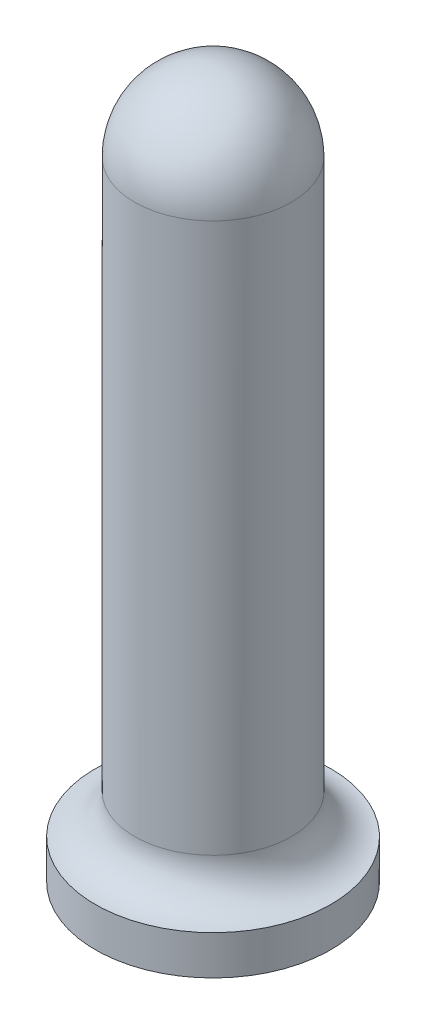
ISO-10303-21;
HEADER;
FILE_DESCRIPTION(('STEP AP214'),'2;1');
FILE_NAME('part.step','',(''),(''),'','','');
FILE_SCHEMA(('AUTOMOTIVE_DESIGN { 1 0 10303 214 1 1 1 1 }'));
ENDSEC;
DATA;
#1=APPLICATION_CONTEXT('core data for automotive mechanical design processes');
#2=APPLICATION_PROTOCOL_DEFINITION('international standard','automotive_design',2000,#1);
#3=PRODUCT_CONTEXT('',#1,'mechanical');
#4=PRODUCT('Part','Part','',(#3));
#5=PRODUCT_RELATED_PRODUCT_CATEGORY('part','',(#4));
#6=PRODUCT_DEFINITION_FORMATION('','',#4);
#7=PRODUCT_DEFINITION_CONTEXT('part definition',#1,'design');
#8=PRODUCT_DEFINITION('design','',#6,#7);
#9=PRODUCT_DEFINITION_SHAPE('','',#8);
#10=(LENGTH_UNIT() NAMED_UNIT(*) SI_UNIT(.MILLI.,.METRE.));
#11=(NAMED_UNIT(*) PLANE_ANGLE_UNIT() SI_UNIT($,.RADIAN.));
#12=(NAMED_UNIT(*) SI_UNIT($,.STERADIAN.) SOLID_ANGLE_UNIT());
#13=UNCERTAINTY_MEASURE_WITH_UNIT(LENGTH_MEASURE(1.E-05),#10,'distance_accuracy_value','');
#14=(GEOMETRIC_REPRESENTATION_CONTEXT(3) GLOBAL_UNCERTAINTY_ASSIGNED_CONTEXT((#13)) GLOBAL_UNIT_ASSIGNED_CONTEXT((#10,
#11,#12)) REPRESENTATION_CONTEXT('',''));
#15=CARTESIAN_POINT('',(0.,0.,0.));
#16=DIRECTION('',(0.,0.,1.));
#17=DIRECTION('',(1.,0.,0.));
#18=AXIS2_PLACEMENT_3D('',#15,#16,#17);
#19=CARTESIAN_POINT('',(0.,15.,0.));
#20=DIRECTION('',(0.,-1.,0.));
#21=DIRECTION('',(0.,0.,-1.));
#22=AXIS2_PLACEMENT_3D('',#19,#20,#21);
#23=CYLINDRICAL_SURFACE('',#22,2.);
#24=CARTESIAN_POINT('',(0.,1.,0.));
#25=DIRECTION('',(0.,-1.,0.));
#26=DIRECTION('',(0.,0.,-1.));
#27=AXIS2_PLACEMENT_3D('',#24,#25,#26);
#28=CIRCLE('',#27,2.);
#29=CARTESIAN_POINT('',(0.,1.,-2.));
#30=VERTEX_POINT('',#29);
#31=EDGE_CURVE('E10',#30,#30,#28,.F.);
#32=ORIENTED_EDGE('',*,*,#31,.T.);
#33=EDGE_LOOP('',(#32));
#34=FACE_BOUND('',#33,.T.);
#35=CARTESIAN_POINT('',(0.,15.,0.));
#36=DIRECTION('',(0.,1.,0.));
#37=DIRECTION('',(0.,0.,1.));
#38=AXIS2_PLACEMENT_3D('',#35,#36,#37);
#39=CIRCLE('',#38,2.);
#40=CARTESIAN_POINT('',(0.,15.,2.));
#41=VERTEX_POINT('',#40);
#42=EDGE_CURVE('E40',#41,#41,#39,.T.);
#43=ORIENTED_EDGE('',*,*,#42,.F.);
#44=EDGE_LOOP('',(#43));
#45=FACE_BOUND('',#44,.T.);
#46=ADVANCED_FACE('F33',(#34,#45),#23,.T.);
#47=CARTESIAN_POINT('',(0.,15.,0.));
#48=DIRECTION('',(1.,0.,0.));
#49=DIRECTION('',(0.,-1.,0.));
#50=AXIS2_PLACEMENT_3D('',#47,#48,#49);
#51=SPHERICAL_SURFACE('',#50,2.);
#52=CARTESIAN_POINT('',(0.,15.,0.));
#53=DIRECTION('',(0.,1.,0.));
#54=DIRECTION('',(0.,0.,1.));
#55=AXIS2_PLACEMENT_3D('',#52,#53,#54);
#56=SPHERICAL_SURFACE('',#55,2.);
#57=ORIENTED_EDGE('',*,*,#42,.T.);
#58=EDGE_LOOP('',(#57));
#59=FACE_BOUND('',#58,.T.);
#60=ADVANCED_FACE('F65',(#59),#56,.T.);
#61=CARTESIAN_POINT('',(0.,-1.,0.));
#62=DIRECTION('',(0.,1.,0.));
#63=DIRECTION('',(0.,0.,1.));
#64=AXIS2_PLACEMENT_3D('',#61,#62,#63);
#65=CYLINDRICAL_SURFACE('',#64,3.);
#66=CARTESIAN_POINT('',(0.,-1.,0.));
#67=DIRECTION('',(0.,-1.,0.));
#68=DIRECTION('',(0.,0.,-1.));
#69=AXIS2_PLACEMENT_3D('',#66,#67,#68);
#70=CIRCLE('',#69,3.);
#71=CARTESIAN_POINT('',(0.,-1.,-3.));
#72=VERTEX_POINT('',#71);
#73=EDGE_CURVE('E44',#72,#72,#70,.T.);
#74=ORIENTED_EDGE('',*,*,#73,.F.);
#75=EDGE_LOOP('',(#74));
#76=FACE_BOUND('',#75,.T.);
#77=CARTESIAN_POINT('',(0.,0.,0.));
#78=DIRECTION('',(0.,-1.,0.));
#79=DIRECTION('',(0.,0.,-1.));
#80=AXIS2_PLACEMENT_3D('',#77,#78,#79);
#81=CIRCLE('',#80,3.);
#82=CARTESIAN_POINT('',(0.,0.,-3.));
#83=VERTEX_POINT('',#82);
#84=EDGE_CURVE('E48',#83,#83,#81,.T.);
#85=ORIENTED_EDGE('',*,*,#84,.T.);
#86=EDGE_LOOP('',(#85));
#87=FACE_BOUND('',#86,.T.);
#88=ADVANCED_FACE('F54',(#76,#87),#65,.T.);
#89=CARTESIAN_POINT('',(0.,-1.,0.));
#90=DIRECTION('',(0.,-1.,0.));
#91=DIRECTION('',(0.,0.,-1.));
#92=AXIS2_PLACEMENT_3D('',#89,#90,#91);
#93=PLANE('',#92);
#94=ORIENTED_EDGE('',*,*,#73,.T.);
#95=EDGE_LOOP('',(#94));
#96=FACE_BOUND('',#95,.T.);
#97=ADVANCED_FACE('F58',(#96),#93,.T.);
#98=CARTESIAN_POINT('',(0.,1.,0.));
#99=DIRECTION('',(0.,-1.,0.));
#100=DIRECTION('',(0.,0.,-1.));
#101=AXIS2_PLACEMENT_3D('',#98,#99,#100);
#102=TOROIDAL_SURFACE('',#101,3.,1.);
#103=ORIENTED_EDGE('',*,*,#84,.F.);
#104=EDGE_LOOP('',(#103));
#105=FACE_BOUND('',#104,.T.);
#106=ORIENTED_EDGE('',*,*,#31,.F.);
#107=EDGE_LOOP('',(#106));
#108=FACE_BOUND('',#107,.T.);
#109=ADVANCED_FACE('F35',(#105,#108),#102,.F.);
#110=CLOSED_SHELL('',(#46,#60,#88,#97,#109));
#111=MANIFOLD_SOLID_BREP('B2',#110);
#112=ADVANCED_BREP_SHAPE_REPRESENTATION('',(#18,#111),#14);
#113=SHAPE_DEFINITION_REPRESENTATION(#9,#112);
ENDSEC;
END-ISO-10303-21;
